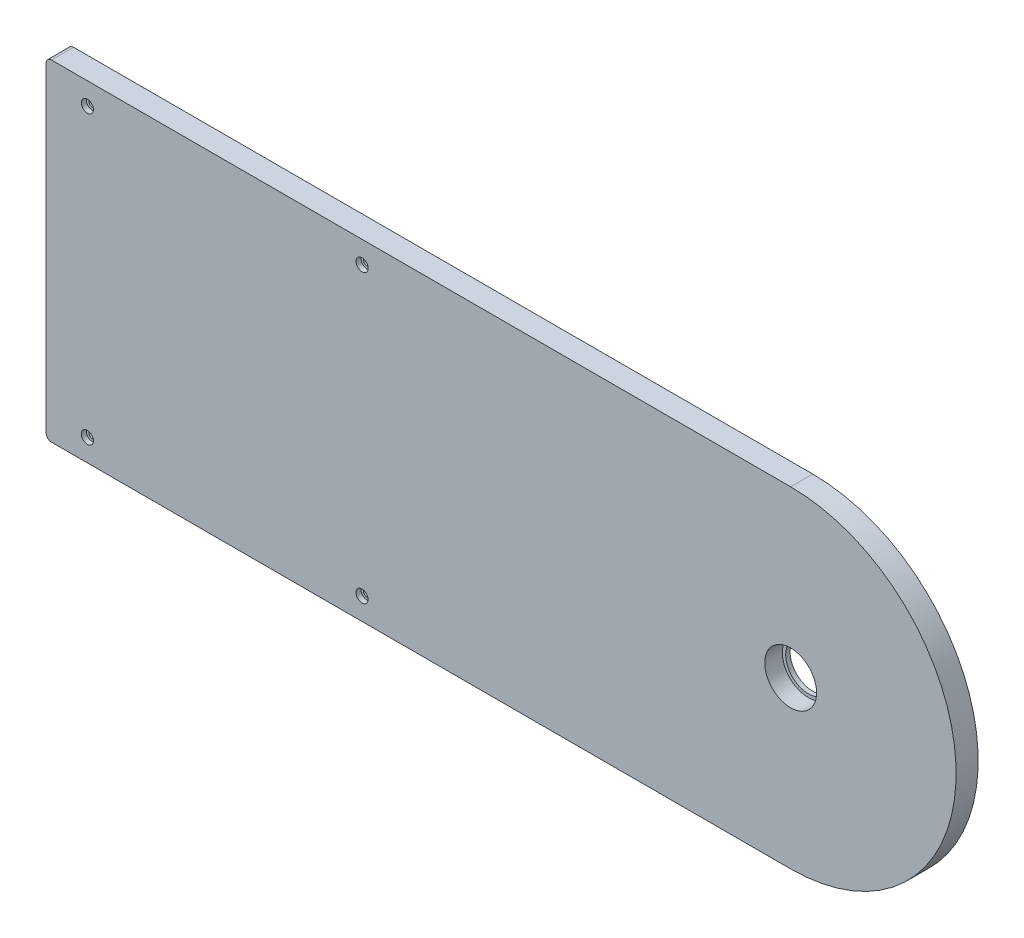
ISO-10303-21;
HEADER;
FILE_DESCRIPTION(('STEP AP214'),'2;1');
FILE_NAME('part.step','',(''),(''),'','','');
FILE_SCHEMA(('AUTOMOTIVE_DESIGN { 1 0 10303 214 1 1 1 1 }'));
ENDSEC;
DATA;
#1=APPLICATION_CONTEXT('core data for automotive mechanical design processes');
#2=APPLICATION_PROTOCOL_DEFINITION('international standard','automotive_design',2000,#1);
#3=PRODUCT_CONTEXT('',#1,'mechanical');
#4=PRODUCT('Part','Part','',(#3));
#5=PRODUCT_RELATED_PRODUCT_CATEGORY('part','',(#4));
#6=PRODUCT_DEFINITION_FORMATION('','',#4);
#7=PRODUCT_DEFINITION_CONTEXT('part definition',#1,'design');
#8=PRODUCT_DEFINITION('design','',#6,#7);
#9=PRODUCT_DEFINITION_SHAPE('','',#8);
#10=(LENGTH_UNIT() NAMED_UNIT(*) SI_UNIT(.MILLI.,.METRE.));
#11=(NAMED_UNIT(*) PLANE_ANGLE_UNIT() SI_UNIT($,.RADIAN.));
#12=(NAMED_UNIT(*) SI_UNIT($,.STERADIAN.) SOLID_ANGLE_UNIT());
#13=UNCERTAINTY_MEASURE_WITH_UNIT(LENGTH_MEASURE(1.E-05),#10,'distance_accuracy_value','');
#14=(GEOMETRIC_REPRESENTATION_CONTEXT(3) GLOBAL_UNCERTAINTY_ASSIGNED_CONTEXT((#13)) GLOBAL_UNIT_ASSIGNED_CONTEXT((#10,
#11,#12)) REPRESENTATION_CONTEXT('',''));
#15=CARTESIAN_POINT('',(0.,0.,0.));
#16=DIRECTION('',(0.,0.,1.));
#17=DIRECTION('',(1.,0.,0.));
#18=AXIS2_PLACEMENT_3D('',#15,#16,#17);
#19=CARTESIAN_POINT('',(-388.5,130.,-3.));
#20=DIRECTION('',(0.,0.,1.));
#21=DIRECTION('',(1.,0.,0.));
#22=AXIS2_PLACEMENT_3D('',#19,#20,#21);
#23=CYLINDRICAL_SURFACE('',#22,3.24999999999995);
#24=CARTESIAN_POINT('',(-388.5,130.,-3.));
#25=DIRECTION('',(0.,0.,1.));
#26=DIRECTION('',(1.,0.,0.));
#27=AXIS2_PLACEMENT_3D('',#24,#25,#26);
#28=CIRCLE('',#27,3.24999999999995);
#29=CARTESIAN_POINT('',(-385.25,130.,-3.));
#30=VERTEX_POINT('',#29);
#31=EDGE_CURVE('E637',#30,#30,#28,.T.);
#32=ORIENTED_EDGE('',*,*,#31,.F.);
#33=EDGE_LOOP('',(#32));
#34=FACE_BOUND('',#33,.T.);
#35=CARTESIAN_POINT('',(-388.5,130.,15.5));
#36=DIRECTION('',(0.,0.,1.));
#37=DIRECTION('',(1.,0.,0.));
#38=AXIS2_PLACEMENT_3D('',#35,#36,#37);
#39=CIRCLE('',#38,3.24999999999995);
#40=CARTESIAN_POINT('',(-385.25,130.,15.5));
#41=VERTEX_POINT('',#40);
#42=EDGE_CURVE('E284',#41,#41,#39,.F.);
#43=ORIENTED_EDGE('',*,*,#42,.F.);
#44=EDGE_LOOP('',(#43));
#45=FACE_BOUND('',#44,.T.);
#46=ADVANCED_FACE('F39',(#34,#45),#23,.F.);
#47=CARTESIAN_POINT('',(-637.5,130.,-3.));
#48=DIRECTION('',(0.,0.,1.));
#49=DIRECTION('',(1.,0.,0.));
#50=AXIS2_PLACEMENT_3D('',#47,#48,#49);
#51=CYLINDRICAL_SURFACE('',#50,3.24999999999995);
#52=CARTESIAN_POINT('',(-637.5,130.,-3.));
#53=DIRECTION('',(0.,0.,1.));
#54=DIRECTION('',(1.,0.,0.));
#55=AXIS2_PLACEMENT_3D('',#52,#53,#54);
#56=CIRCLE('',#55,3.24999999999995);
#57=CARTESIAN_POINT('',(-634.25,130.,-3.));
#58=VERTEX_POINT('',#57);
#59=EDGE_CURVE('E633',#58,#58,#56,.T.);
#60=ORIENTED_EDGE('',*,*,#59,.F.);
#61=EDGE_LOOP('',(#60));
#62=FACE_BOUND('',#61,.T.);
#63=CARTESIAN_POINT('',(-637.5,130.,15.5));
#64=DIRECTION('',(0.,0.,1.));
#65=DIRECTION('',(1.,0.,0.));
#66=AXIS2_PLACEMENT_3D('',#63,#64,#65);
#67=CIRCLE('',#66,3.24999999999995);
#68=CARTESIAN_POINT('',(-634.25,130.,15.5));
#69=VERTEX_POINT('',#68);
#70=EDGE_CURVE('E280',#69,#69,#67,.F.);
#71=ORIENTED_EDGE('',*,*,#70,.F.);
#72=EDGE_LOOP('',(#71));
#73=FACE_BOUND('',#72,.T.);
#74=ADVANCED_FACE('F331',(#62,#73),#51,.F.);
#75=CARTESIAN_POINT('',(-637.5,-130.,-3.));
#76=DIRECTION('',(0.,0.,1.));
#77=DIRECTION('',(1.,0.,0.));
#78=AXIS2_PLACEMENT_3D('',#75,#76,#77);
#79=CYLINDRICAL_SURFACE('',#78,3.24999999999995);
#80=CARTESIAN_POINT('',(-637.5,-130.,-3.));
#81=DIRECTION('',(0.,0.,1.));
#82=DIRECTION('',(1.,0.,0.));
#83=AXIS2_PLACEMENT_3D('',#80,#81,#82);
#84=CIRCLE('',#83,3.24999999999995);
#85=CARTESIAN_POINT('',(-634.25,-130.,-3.));
#86=VERTEX_POINT('',#85);
#87=EDGE_CURVE('E629',#86,#86,#84,.T.);
#88=ORIENTED_EDGE('',*,*,#87,.F.);
#89=EDGE_LOOP('',(#88));
#90=FACE_BOUND('',#89,.T.);
#91=CARTESIAN_POINT('',(-637.5,-130.,15.5));
#92=DIRECTION('',(0.,0.,1.));
#93=DIRECTION('',(1.,0.,0.));
#94=AXIS2_PLACEMENT_3D('',#91,#92,#93);
#95=CIRCLE('',#94,3.24999999999995);
#96=CARTESIAN_POINT('',(-634.25,-130.,15.5));
#97=VERTEX_POINT('',#96);
#98=EDGE_CURVE('E275',#97,#97,#95,.F.);
#99=ORIENTED_EDGE('',*,*,#98,.F.);
#100=EDGE_LOOP('',(#99));
#101=FACE_BOUND('',#100,.T.);
#102=ADVANCED_FACE('F337',(#90,#101),#79,.F.);
#103=CARTESIAN_POINT('',(-388.5,-130.,-3.));
#104=DIRECTION('',(0.,0.,1.));
#105=DIRECTION('',(1.,0.,0.));
#106=AXIS2_PLACEMENT_3D('',#103,#104,#105);
#107=CYLINDRICAL_SURFACE('',#106,3.24999999999995);
#108=CARTESIAN_POINT('',(-388.5,-130.,-3.));
#109=DIRECTION('',(0.,0.,1.));
#110=DIRECTION('',(1.,0.,0.));
#111=AXIS2_PLACEMENT_3D('',#108,#109,#110);
#112=CIRCLE('',#111,3.24999999999995);
#113=CARTESIAN_POINT('',(-385.25,-130.,-3.));
#114=VERTEX_POINT('',#113);
#115=EDGE_CURVE('E288',#114,#114,#112,.T.);
#116=ORIENTED_EDGE('',*,*,#115,.F.);
#117=EDGE_LOOP('',(#116));
#118=FACE_BOUND('',#117,.T.);
#119=CARTESIAN_POINT('',(-388.5,-130.,15.5));
#120=DIRECTION('',(0.,0.,1.));
#121=DIRECTION('',(1.,0.,0.));
#122=AXIS2_PLACEMENT_3D('',#119,#120,#121);
#123=CIRCLE('',#122,3.24999999999995);
#124=CARTESIAN_POINT('',(-385.25,-130.,15.5));
#125=VERTEX_POINT('',#124);
#126=EDGE_CURVE('E271',#125,#125,#123,.F.);
#127=ORIENTED_EDGE('',*,*,#126,.F.);
#128=EDGE_LOOP('',(#127));
#129=FACE_BOUND('',#128,.T.);
#130=ADVANCED_FACE('F344',(#118,#129),#107,.F.);
#131=CARTESIAN_POINT('',(0.,0.,0.));
#132=DIRECTION('',(0.,0.,1.));
#133=DIRECTION('',(1.,0.,0.));
#134=AXIS2_PLACEMENT_3D('',#131,#132,#133);
#135=PLANE('',#134);
#136=CARTESIAN_POINT('',(0.,0.,0.));
#137=DIRECTION('',(0.,0.,1.));
#138=DIRECTION('',(1.,0.,0.));
#139=AXIS2_PLACEMENT_3D('',#136,#137,#138);
#140=CIRCLE('',#139,20.5);
#141=CARTESIAN_POINT('',(20.5,0.,0.));
#142=VERTEX_POINT('',#141);
#143=EDGE_CURVE('E228',#142,#142,#140,.T.);
#144=ORIENTED_EDGE('',*,*,#143,.T.);
#145=EDGE_LOOP('',(#144));
#146=FACE_BOUND('',#145,.T.);
#147=DIRECTION('',(0.,-1.,0.));
#148=VECTOR('',#147,1.);
#149=CARTESIAN_POINT('',(-675.,150.,0.));
#150=LINE('',#149,#148);
#151=CARTESIAN_POINT('',(-675.,145.,0.));
#152=VERTEX_POINT('',#151);
#153=CARTESIAN_POINT('',(-675.,134.,0.));
#154=VERTEX_POINT('',#153);
#155=EDGE_CURVE('E170',#152,#154,#150,.T.);
#156=ORIENTED_EDGE('',*,*,#155,.F.);
#157=CARTESIAN_POINT('',(-670.,145.,0.));
#158=DIRECTION('',(0.,0.,1.));
#159=DIRECTION('',(1.,0.,0.));
#160=AXIS2_PLACEMENT_3D('',#157,#158,#159);
#161=CIRCLE('',#160,5.);
#162=CARTESIAN_POINT('',(-670.,150.,0.));
#163=VERTEX_POINT('',#162);
#164=EDGE_CURVE('E297',#152,#163,#161,.F.);
#165=ORIENTED_EDGE('',*,*,#164,.T.);
#166=DIRECTION('',(-1.,0.,0.));
#167=VECTOR('',#166,1.);
#168=CARTESIAN_POINT('',(0.,150.,0.));
#169=LINE('',#168,#167);
#170=CARTESIAN_POINT('',(0.,150.,0.));
#171=VERTEX_POINT('',#170);
#172=EDGE_CURVE('E251',#171,#163,#169,.T.);
#173=ORIENTED_EDGE('',*,*,#172,.F.);
#174=CARTESIAN_POINT('',(0.,0.,0.));
#175=DIRECTION('',(0.,0.,1.));
#176=DIRECTION('',(1.,0.,0.));
#177=AXIS2_PLACEMENT_3D('',#174,#175,#176);
#178=CIRCLE('',#177,150.);
#179=CARTESIAN_POINT('',(0.,-150.,0.));
#180=VERTEX_POINT('',#179);
#181=EDGE_CURVE('E232',#180,#171,#178,.T.);
#182=ORIENTED_EDGE('',*,*,#181,.F.);
#183=DIRECTION('',(1.,0.,0.));
#184=VECTOR('',#183,1.);
#185=CARTESIAN_POINT('',(-675.,-150.,0.));
#186=LINE('',#185,#184);
#187=CARTESIAN_POINT('',(-670.,-150.,0.));
#188=VERTEX_POINT('',#187);
#189=EDGE_CURVE('E238',#188,#180,#186,.T.);
#190=ORIENTED_EDGE('',*,*,#189,.F.);
#191=CARTESIAN_POINT('',(-670.,-145.,0.));
#192=DIRECTION('',(0.,0.,1.));
#193=DIRECTION('',(1.,0.,0.));
#194=AXIS2_PLACEMENT_3D('',#191,#192,#193);
#195=CIRCLE('',#194,5.);
#196=CARTESIAN_POINT('',(-675.,-145.,0.));
#197=VERTEX_POINT('',#196);
#198=EDGE_CURVE('E294',#188,#197,#195,.F.);
#199=ORIENTED_EDGE('',*,*,#198,.T.);
#200=CARTESIAN_POINT('',(-675.,-134.,0.));
#201=VERTEX_POINT('',#200);
#202=EDGE_CURVE('E254',#201,#197,#150,.T.);
#203=ORIENTED_EDGE('',*,*,#202,.F.);
#204=DIRECTION('',(-1.,0.,0.));
#205=VECTOR('',#204,1.);
#206=CARTESIAN_POINT('',(-675.,-134.,0.));
#207=LINE('',#206,#205);
#208=CARTESIAN_POINT('',(-356.25,-134.,0.));
#209=VERTEX_POINT('',#208);
#210=EDGE_CURVE('E188',#209,#201,#207,.T.);
#211=ORIENTED_EDGE('',*,*,#210,.F.);
#212=DIRECTION('',(0.,-1.,0.));
#213=VECTOR('',#212,1.);
#214=CARTESIAN_POINT('',(-356.25,-134.,0.));
#215=LINE('',#214,#213);
#216=CARTESIAN_POINT('',(-356.25,-126.,0.));
#217=VERTEX_POINT('',#216);
#218=EDGE_CURVE('E177',#217,#209,#215,.T.);
#219=ORIENTED_EDGE('',*,*,#218,.F.);
#220=DIRECTION('',(1.,0.,0.));
#221=VECTOR('',#220,1.);
#222=CARTESIAN_POINT('',(-675.,-126.,0.));
#223=LINE('',#222,#221);
#224=CARTESIAN_POINT('',(-675.,-126.,0.));
#225=VERTEX_POINT('',#224);
#226=EDGE_CURVE('E172',#225,#217,#223,.T.);
#227=ORIENTED_EDGE('',*,*,#226,.F.);
#228=CARTESIAN_POINT('',(-675.,126.,0.));
#229=VERTEX_POINT('',#228);
#230=EDGE_CURVE('E257',#229,#225,#150,.T.);
#231=ORIENTED_EDGE('',*,*,#230,.F.);
#232=DIRECTION('',(-1.,0.,0.));
#233=VECTOR('',#232,1.);
#234=CARTESIAN_POINT('',(-675.,126.,0.));
#235=LINE('',#234,#233);
#236=CARTESIAN_POINT('',(-356.25,126.,0.));
#237=VERTEX_POINT('',#236);
#238=EDGE_CURVE('E164',#237,#229,#235,.T.);
#239=ORIENTED_EDGE('',*,*,#238,.F.);
#240=DIRECTION('',(0.,-1.,0.));
#241=VECTOR('',#240,1.);
#242=CARTESIAN_POINT('',(-356.25,126.,0.));
#243=LINE('',#242,#241);
#244=CARTESIAN_POINT('',(-356.25,134.,0.));
#245=VERTEX_POINT('',#244);
#246=EDGE_CURVE('E649',#245,#237,#243,.T.);
#247=ORIENTED_EDGE('',*,*,#246,.F.);
#248=DIRECTION('',(1.,0.,0.));
#249=VECTOR('',#248,1.);
#250=CARTESIAN_POINT('',(-675.,134.,0.));
#251=LINE('',#250,#249);
#252=EDGE_CURVE('E640',#154,#245,#251,.T.);
#253=ORIENTED_EDGE('',*,*,#252,.F.);
#254=EDGE_LOOP('',(#156,#165,#173,#182,#190,#199,#203,#211,#219,#227,#231,#239,#247,#253));
#255=FACE_BOUND('',#254,.T.);
#256=ADVANCED_FACE('F312',(#146,#255),#135,.F.);
#257=CARTESIAN_POINT('',(0.,0.,20.));
#258=DIRECTION('',(0.,0.,-1.));
#259=DIRECTION('',(-1.,0.,0.));
#260=AXIS2_PLACEMENT_3D('',#257,#258,#259);
#261=CYLINDRICAL_SURFACE('',#260,20.5);
#262=ORIENTED_EDGE('',*,*,#143,.F.);
#263=EDGE_LOOP('',(#262));
#264=FACE_BOUND('',#263,.T.);
#265=CARTESIAN_POINT('',(0.,0.,4.));
#266=DIRECTION('',(0.,0.,1.));
#267=DIRECTION('',(1.,0.,0.));
#268=AXIS2_PLACEMENT_3D('',#265,#266,#267);
#269=CIRCLE('',#268,20.5);
#270=CARTESIAN_POINT('',(20.5,0.,4.));
#271=VERTEX_POINT('',#270);
#272=EDGE_CURVE('E224',#271,#271,#269,.T.);
#273=ORIENTED_EDGE('',*,*,#272,.T.);
#274=EDGE_LOOP('',(#273));
#275=FACE_BOUND('',#274,.T.);
#276=ADVANCED_FACE('F384',(#264,#275),#261,.F.);
#277=CARTESIAN_POINT('',(0.,0.,20.));
#278=DIRECTION('',(0.,0.,1.));
#279=DIRECTION('',(1.,0.,0.));
#280=AXIS2_PLACEMENT_3D('',#277,#278,#279);
#281=PLANE('',#280);
#282=CARTESIAN_POINT('',(-637.5,-130.,20.));
#283=DIRECTION('',(0.,0.,1.));
#284=DIRECTION('',(1.,0.,0.));
#285=AXIS2_PLACEMENT_3D('',#282,#283,#284);
#286=CIRCLE('',#285,5.50000000000007);
#287=CARTESIAN_POINT('',(-632.,-130.,20.));
#288=VERTEX_POINT('',#287);
#289=EDGE_CURVE('E685',#288,#288,#286,.T.);
#290=ORIENTED_EDGE('',*,*,#289,.F.);
#291=EDGE_LOOP('',(#290));
#292=FACE_BOUND('',#291,.T.);
#293=CARTESIAN_POINT('',(-388.5,-130.,20.));
#294=DIRECTION('',(0.,0.,1.));
#295=DIRECTION('',(1.,0.,0.));
#296=AXIS2_PLACEMENT_3D('',#293,#294,#295);
#297=CIRCLE('',#296,5.49999999999996);
#298=CARTESIAN_POINT('',(-383.,-130.,20.));
#299=VERTEX_POINT('',#298);
#300=EDGE_CURVE('E693',#299,#299,#297,.T.);
#301=ORIENTED_EDGE('',*,*,#300,.F.);
#302=EDGE_LOOP('',(#301));
#303=FACE_BOUND('',#302,.T.);
#304=CARTESIAN_POINT('',(-388.5,130.,20.));
#305=DIRECTION('',(0.,0.,1.));
#306=DIRECTION('',(1.,0.,0.));
#307=AXIS2_PLACEMENT_3D('',#304,#305,#306);
#308=CIRCLE('',#307,5.49999999999996);
#309=CARTESIAN_POINT('',(-383.,130.,20.));
#310=VERTEX_POINT('',#309);
#311=EDGE_CURVE('E701',#310,#310,#308,.T.);
#312=ORIENTED_EDGE('',*,*,#311,.F.);
#313=EDGE_LOOP('',(#312));
#314=FACE_BOUND('',#313,.T.);
#315=CARTESIAN_POINT('',(-637.5,130.,20.));
#316=DIRECTION('',(0.,0.,1.));
#317=DIRECTION('',(1.,0.,0.));
#318=AXIS2_PLACEMENT_3D('',#315,#316,#317);
#319=CIRCLE('',#318,5.50000000000007);
#320=CARTESIAN_POINT('',(-632.,130.,20.));
#321=VERTEX_POINT('',#320);
#322=EDGE_CURVE('E677',#321,#321,#319,.T.);
#323=ORIENTED_EDGE('',*,*,#322,.F.);
#324=EDGE_LOOP('',(#323));
#325=FACE_BOUND('',#324,.T.);
#326=CARTESIAN_POINT('',(0.,0.,20.));
#327=DIRECTION('',(0.,0.,1.));
#328=DIRECTION('',(1.,0.,0.));
#329=AXIS2_PLACEMENT_3D('',#326,#327,#328);
#330=CIRCLE('',#329,23.5);
#331=CARTESIAN_POINT('',(23.5,0.,20.));
#332=VERTEX_POINT('',#331);
#333=EDGE_CURVE('E219',#332,#332,#330,.T.);
#334=ORIENTED_EDGE('',*,*,#333,.F.);
#335=EDGE_LOOP('',(#334));
#336=FACE_BOUND('',#335,.T.);
#337=DIRECTION('',(-1.,0.,0.));
#338=VECTOR('',#337,1.);
#339=CARTESIAN_POINT('',(0.,150.,20.));
#340=LINE('',#339,#338);
#341=CARTESIAN_POINT('',(0.,150.,20.));
#342=VERTEX_POINT('',#341);
#343=CARTESIAN_POINT('',(-670.,150.,20.));
#344=VERTEX_POINT('',#343);
#345=EDGE_CURVE('E237',#342,#344,#340,.T.);
#346=ORIENTED_EDGE('',*,*,#345,.T.);
#347=CARTESIAN_POINT('',(-670.,145.,20.));
#348=DIRECTION('',(0.,0.,1.));
#349=DIRECTION('',(1.,0.,0.));
#350=AXIS2_PLACEMENT_3D('',#347,#348,#349);
#351=CIRCLE('',#350,5.);
#352=CARTESIAN_POINT('',(-675.,145.,20.));
#353=VERTEX_POINT('',#352);
#354=EDGE_CURVE('E48',#344,#353,#351,.T.);
#355=ORIENTED_EDGE('',*,*,#354,.T.);
#356=DIRECTION('',(0.,-1.,0.));
#357=VECTOR('',#356,1.);
#358=CARTESIAN_POINT('',(-675.,150.,20.));
#359=LINE('',#358,#357);
#360=CARTESIAN_POINT('',(-675.,-145.,20.));
#361=VERTEX_POINT('',#360);
#362=EDGE_CURVE('E241',#353,#361,#359,.T.);
#363=ORIENTED_EDGE('',*,*,#362,.T.);
#364=CARTESIAN_POINT('',(-670.,-145.,20.));
#365=DIRECTION('',(0.,0.,1.));
#366=DIRECTION('',(1.,0.,0.));
#367=AXIS2_PLACEMENT_3D('',#364,#365,#366);
#368=CIRCLE('',#367,5.);
#369=CARTESIAN_POINT('',(-670.,-150.,20.));
#370=VERTEX_POINT('',#369);
#371=EDGE_CURVE('E55',#361,#370,#368,.T.);
#372=ORIENTED_EDGE('',*,*,#371,.T.);
#373=DIRECTION('',(1.,0.,0.));
#374=VECTOR('',#373,1.);
#375=CARTESIAN_POINT('',(-675.,-150.,20.));
#376=LINE('',#375,#374);
#377=CARTESIAN_POINT('',(0.,-150.,20.));
#378=VERTEX_POINT('',#377);
#379=EDGE_CURVE('E244',#370,#378,#376,.T.);
#380=ORIENTED_EDGE('',*,*,#379,.T.);
#381=CARTESIAN_POINT('',(0.,0.,20.));
#382=DIRECTION('',(0.,0.,1.));
#383=DIRECTION('',(1.,0.,0.));
#384=AXIS2_PLACEMENT_3D('',#381,#382,#383);
#385=CIRCLE('',#384,150.);
#386=EDGE_CURVE('E233',#378,#342,#385,.T.);
#387=ORIENTED_EDGE('',*,*,#386,.T.);
#388=EDGE_LOOP('',(#346,#355,#363,#372,#380,#387));
#389=FACE_BOUND('',#388,.T.);
#390=ADVANCED_FACE('F305',(#292,#303,#314,#325,#336,#389),#281,.T.);
#391=CARTESIAN_POINT('',(0.,0.,20.));
#392=DIRECTION('',(0.,0.,-1.));
#393=DIRECTION('',(-1.,0.,0.));
#394=AXIS2_PLACEMENT_3D('',#391,#392,#393);
#395=CYLINDRICAL_SURFACE('',#394,150.);
#396=ORIENTED_EDGE('',*,*,#181,.T.);
#397=DIRECTION('',(0.,0.,-1.));
#398=VECTOR('',#397,1.);
#399=CARTESIAN_POINT('',(0.,150.,20.));
#400=LINE('',#399,#398);
#401=EDGE_CURVE('E263',#342,#171,#400,.T.);
#402=ORIENTED_EDGE('',*,*,#401,.F.);
#403=ORIENTED_EDGE('',*,*,#386,.F.);
#404=DIRECTION('',(0.,0.,-1.));
#405=VECTOR('',#404,1.);
#406=CARTESIAN_POINT('',(0.,-150.,20.));
#407=LINE('',#406,#405);
#408=EDGE_CURVE('E247',#378,#180,#407,.T.);
#409=ORIENTED_EDGE('',*,*,#408,.T.);
#410=EDGE_LOOP('',(#396,#402,#403,#409));
#411=FACE_BOUND('',#410,.T.);
#412=ADVANCED_FACE('F318',(#411),#395,.T.);
#413=CARTESIAN_POINT('',(0.,150.,20.));
#414=DIRECTION('',(0.,-1.,0.));
#415=DIRECTION('',(0.,0.,-1.));
#416=AXIS2_PLACEMENT_3D('',#413,#414,#415);
#417=PLANE('',#416);
#418=ORIENTED_EDGE('',*,*,#172,.T.);
#419=DIRECTION('',(0.,0.,-1.));
#420=VECTOR('',#419,1.);
#421=CARTESIAN_POINT('',(-670.,150.,20.));
#422=LINE('',#421,#420);
#423=EDGE_CURVE('E63',#163,#344,#422,.F.);
#424=ORIENTED_EDGE('',*,*,#423,.T.);
#425=ORIENTED_EDGE('',*,*,#345,.F.);
#426=ORIENTED_EDGE('',*,*,#401,.T.);
#427=EDGE_LOOP('',(#418,#424,#425,#426));
#428=FACE_BOUND('',#427,.T.);
#429=ADVANCED_FACE('F314',(#428),#417,.F.);
#430=CARTESIAN_POINT('',(-675.,150.,20.));
#431=DIRECTION('',(1.,0.,0.));
#432=DIRECTION('',(0.,0.,-1.));
#433=AXIS2_PLACEMENT_3D('',#430,#431,#432);
#434=PLANE('',#433);
#435=ORIENTED_EDGE('',*,*,#362,.F.);
#436=DIRECTION('',(0.,0.,-1.));
#437=VECTOR('',#436,1.);
#438=CARTESIAN_POINT('',(-675.,145.,20.));
#439=LINE('',#438,#437);
#440=EDGE_CURVE('E291',#353,#152,#439,.T.);
#441=ORIENTED_EDGE('',*,*,#440,.T.);
#442=ORIENTED_EDGE('',*,*,#155,.T.);
#443=DIRECTION('',(0.,0.,1.));
#444=VECTOR('',#443,1.);
#445=CARTESIAN_POINT('',(-675.,134.,-3.));
#446=LINE('',#445,#444);
#447=CARTESIAN_POINT('',(-675.,134.,-3.));
#448=VERTEX_POINT('',#447);
#449=EDGE_CURVE('E147',#448,#154,#446,.T.);
#450=ORIENTED_EDGE('',*,*,#449,.F.);
#451=DIRECTION('',(0.,1.,0.));
#452=VECTOR('',#451,1.);
#453=CARTESIAN_POINT('',(-675.,126.,-3.));
#454=LINE('',#453,#452);
#455=CARTESIAN_POINT('',(-675.,126.,-3.));
#456=VERTEX_POINT('',#455);
#457=EDGE_CURVE('E155',#456,#448,#454,.T.);
#458=ORIENTED_EDGE('',*,*,#457,.F.);
#459=DIRECTION('',(0.,0.,1.));
#460=VECTOR('',#459,1.);
#461=CARTESIAN_POINT('',(-675.,126.,-3.));
#462=LINE('',#461,#460);
#463=EDGE_CURVE('E646',#456,#229,#462,.T.);
#464=ORIENTED_EDGE('',*,*,#463,.T.);
#465=ORIENTED_EDGE('',*,*,#230,.T.);
#466=DIRECTION('',(0.,0.,1.));
#467=VECTOR('',#466,1.);
#468=CARTESIAN_POINT('',(-675.,-126.,-3.));
#469=LINE('',#468,#467);
#470=CARTESIAN_POINT('',(-675.,-126.,-3.));
#471=VERTEX_POINT('',#470);
#472=EDGE_CURVE('E215',#471,#225,#469,.T.);
#473=ORIENTED_EDGE('',*,*,#472,.F.);
#474=DIRECTION('',(0.,1.,0.));
#475=VECTOR('',#474,1.);
#476=CARTESIAN_POINT('',(-675.,-134.,-3.));
#477=LINE('',#476,#475);
#478=CARTESIAN_POINT('',(-675.,-134.,-3.));
#479=VERTEX_POINT('',#478);
#480=EDGE_CURVE('E183',#479,#471,#477,.T.);
#481=ORIENTED_EDGE('',*,*,#480,.F.);
#482=DIRECTION('',(0.,0.,1.));
#483=VECTOR('',#482,1.);
#484=CARTESIAN_POINT('',(-675.,-134.,-3.));
#485=LINE('',#484,#483);
#486=EDGE_CURVE('E196',#479,#201,#485,.T.);
#487=ORIENTED_EDGE('',*,*,#486,.T.);
#488=ORIENTED_EDGE('',*,*,#202,.T.);
#489=DIRECTION('',(0.,0.,-1.));
#490=VECTOR('',#489,1.);
#491=CARTESIAN_POINT('',(-675.,-145.,20.));
#492=LINE('',#491,#490);
#493=EDGE_CURVE('E267',#197,#361,#492,.F.);
#494=ORIENTED_EDGE('',*,*,#493,.T.);
#495=EDGE_LOOP('',(#435,#441,#442,#450,#458,#464,#465,#473,#481,#487,#488,#494));
#496=FACE_BOUND('',#495,.T.);
#497=ADVANCED_FACE('F167',(#496),#434,.F.);
#498=CARTESIAN_POINT('',(-675.,-150.,20.));
#499=DIRECTION('',(0.,1.,0.));
#500=DIRECTION('',(0.,0.,1.));
#501=AXIS2_PLACEMENT_3D('',#498,#499,#500);
#502=PLANE('',#501);
#503=ORIENTED_EDGE('',*,*,#379,.F.);
#504=DIRECTION('',(0.,0.,-1.));
#505=VECTOR('',#504,1.);
#506=CARTESIAN_POINT('',(-670.,-150.,20.));
#507=LINE('',#506,#505);
#508=EDGE_CURVE('E11',#370,#188,#507,.T.);
#509=ORIENTED_EDGE('',*,*,#508,.T.);
#510=ORIENTED_EDGE('',*,*,#189,.T.);
#511=ORIENTED_EDGE('',*,*,#408,.F.);
#512=EDGE_LOOP('',(#503,#509,#510,#511));
#513=FACE_BOUND('',#512,.T.);
#514=ADVANCED_FACE('F322',(#513),#502,.F.);
#515=CARTESIAN_POINT('',(0.,0.,4.));
#516=DIRECTION('',(0.,0.,1.));
#517=DIRECTION('',(1.,0.,0.));
#518=AXIS2_PLACEMENT_3D('',#515,#516,#517);
#519=CYLINDRICAL_SURFACE('',#518,23.5);
#520=CARTESIAN_POINT('',(0.,0.,4.));
#521=DIRECTION('',(0.,0.,1.));
#522=DIRECTION('',(1.,0.,0.));
#523=AXIS2_PLACEMENT_3D('',#520,#521,#522);
#524=CIRCLE('',#523,23.5);
#525=CARTESIAN_POINT('',(23.5,0.,4.));
#526=VERTEX_POINT('',#525);
#527=EDGE_CURVE('E220',#526,#526,#524,.T.);
#528=ORIENTED_EDGE('',*,*,#527,.F.);
#529=EDGE_LOOP('',(#528));
#530=FACE_BOUND('',#529,.T.);
#531=ORIENTED_EDGE('',*,*,#333,.T.);
#532=EDGE_LOOP('',(#531));
#533=FACE_BOUND('',#532,.T.);
#534=ADVANCED_FACE('F379',(#530,#533),#519,.F.);
#535=CARTESIAN_POINT('',(0.,0.,4.));
#536=DIRECTION('',(0.,0.,1.));
#537=DIRECTION('',(1.,0.,0.));
#538=AXIS2_PLACEMENT_3D('',#535,#536,#537);
#539=PLANE('',#538);
#540=ORIENTED_EDGE('',*,*,#272,.F.);
#541=EDGE_LOOP('',(#540));
#542=FACE_BOUND('',#541,.T.);
#543=ORIENTED_EDGE('',*,*,#527,.T.);
#544=EDGE_LOOP('',(#543));
#545=FACE_BOUND('',#544,.T.);
#546=ADVANCED_FACE('F375',(#542,#545),#539,.T.);
#547=CARTESIAN_POINT('',(-675.,-126.,-3.));
#548=DIRECTION('',(0.,-1.,0.));
#549=DIRECTION('',(0.,0.,-1.));
#550=AXIS2_PLACEMENT_3D('',#547,#548,#549);
#551=PLANE('',#550);
#552=ORIENTED_EDGE('',*,*,#226,.T.);
#553=DIRECTION('',(0.,0.,1.));
#554=VECTOR('',#553,1.);
#555=CARTESIAN_POINT('',(-356.25,-126.,-3.));
#556=LINE('',#555,#554);
#557=CARTESIAN_POINT('',(-356.25,-126.,-3.));
#558=VERTEX_POINT('',#557);
#559=EDGE_CURVE('E211',#558,#217,#556,.T.);
#560=ORIENTED_EDGE('',*,*,#559,.F.);
#561=DIRECTION('',(1.,0.,0.));
#562=VECTOR('',#561,1.);
#563=CARTESIAN_POINT('',(-675.,-126.,-3.));
#564=LINE('',#563,#562);
#565=EDGE_CURVE('E187',#471,#558,#564,.T.);
#566=ORIENTED_EDGE('',*,*,#565,.F.);
#567=ORIENTED_EDGE('',*,*,#472,.T.);
#568=EDGE_LOOP('',(#552,#560,#566,#567));
#569=FACE_BOUND('',#568,.T.);
#570=ADVANCED_FACE('F371',(#569),#551,.F.);
#571=CARTESIAN_POINT('',(-356.25,-134.,-3.));
#572=DIRECTION('',(-1.,0.,0.));
#573=DIRECTION('',(0.,0.,1.));
#574=AXIS2_PLACEMENT_3D('',#571,#572,#573);
#575=PLANE('',#574);
#576=ORIENTED_EDGE('',*,*,#218,.T.);
#577=DIRECTION('',(0.,0.,1.));
#578=VECTOR('',#577,1.);
#579=CARTESIAN_POINT('',(-356.25,-134.,-3.));
#580=LINE('',#579,#578);
#581=CARTESIAN_POINT('',(-356.25,-134.,-3.));
#582=VERTEX_POINT('',#581);
#583=EDGE_CURVE('E207',#582,#209,#580,.T.);
#584=ORIENTED_EDGE('',*,*,#583,.F.);
#585=DIRECTION('',(0.,-1.,0.));
#586=VECTOR('',#585,1.);
#587=CARTESIAN_POINT('',(-356.25,-134.,-3.));
#588=LINE('',#587,#586);
#589=EDGE_CURVE('E191',#558,#582,#588,.T.);
#590=ORIENTED_EDGE('',*,*,#589,.F.);
#591=ORIENTED_EDGE('',*,*,#559,.T.);
#592=EDGE_LOOP('',(#576,#584,#590,#591));
#593=FACE_BOUND('',#592,.T.);
#594=ADVANCED_FACE('F367',(#593),#575,.F.);
#595=CARTESIAN_POINT('',(-675.,-134.,-3.));
#596=DIRECTION('',(0.,1.,0.));
#597=DIRECTION('',(-1.,0.,0.));
#598=AXIS2_PLACEMENT_3D('',#595,#596,#597);
#599=PLANE('',#598);
#600=ORIENTED_EDGE('',*,*,#210,.T.);
#601=ORIENTED_EDGE('',*,*,#486,.F.);
#602=DIRECTION('',(-1.,0.,0.));
#603=VECTOR('',#602,1.);
#604=CARTESIAN_POINT('',(-675.,-134.,-3.));
#605=LINE('',#604,#603);
#606=EDGE_CURVE('E194',#582,#479,#605,.T.);
#607=ORIENTED_EDGE('',*,*,#606,.F.);
#608=ORIENTED_EDGE('',*,*,#583,.T.);
#609=EDGE_LOOP('',(#600,#601,#607,#608));
#610=FACE_BOUND('',#609,.T.);
#611=ADVANCED_FACE('F363',(#610),#599,.F.);
#612=CARTESIAN_POINT('',(0.,0.,-3.));
#613=DIRECTION('',(0.,0.,-1.));
#614=DIRECTION('',(-1.,0.,0.));
#615=AXIS2_PLACEMENT_3D('',#612,#613,#614);
#616=PLANE('',#615);
#617=ORIENTED_EDGE('',*,*,#115,.T.);
#618=EDGE_LOOP('',(#617));
#619=FACE_BOUND('',#618,.T.);
#620=ORIENTED_EDGE('',*,*,#87,.T.);
#621=EDGE_LOOP('',(#620));
#622=FACE_BOUND('',#621,.T.);
#623=ORIENTED_EDGE('',*,*,#480,.T.);
#624=ORIENTED_EDGE('',*,*,#565,.T.);
#625=ORIENTED_EDGE('',*,*,#589,.T.);
#626=ORIENTED_EDGE('',*,*,#606,.T.);
#627=EDGE_LOOP('',(#623,#624,#625,#626));
#628=FACE_BOUND('',#627,.T.);
#629=ADVANCED_FACE('F360',(#619,#622,#628),#616,.T.);
#630=CARTESIAN_POINT('',(-675.,134.,-3.));
#631=DIRECTION('',(0.,-1.,0.));
#632=DIRECTION('',(1.,0.,0.));
#633=AXIS2_PLACEMENT_3D('',#630,#631,#632);
#634=PLANE('',#633);
#635=ORIENTED_EDGE('',*,*,#252,.T.);
#636=DIRECTION('',(0.,0.,1.));
#637=VECTOR('',#636,1.);
#638=CARTESIAN_POINT('',(-356.25,134.,-3.));
#639=LINE('',#638,#637);
#640=CARTESIAN_POINT('',(-356.25,134.,-3.));
#641=VERTEX_POINT('',#640);
#642=EDGE_CURVE('E150',#641,#245,#639,.T.);
#643=ORIENTED_EDGE('',*,*,#642,.F.);
#644=DIRECTION('',(1.,0.,0.));
#645=VECTOR('',#644,1.);
#646=CARTESIAN_POINT('',(-675.,134.,-3.));
#647=LINE('',#646,#645);
#648=EDGE_CURVE('E143',#448,#641,#647,.T.);
#649=ORIENTED_EDGE('',*,*,#648,.F.);
#650=ORIENTED_EDGE('',*,*,#449,.T.);
#651=EDGE_LOOP('',(#635,#643,#649,#650));
#652=FACE_BOUND('',#651,.T.);
#653=ADVANCED_FACE('F145',(#652),#634,.F.);
#654=CARTESIAN_POINT('',(-356.25,126.,-3.));
#655=DIRECTION('',(-1.,0.,0.));
#656=DIRECTION('',(0.,0.,1.));
#657=AXIS2_PLACEMENT_3D('',#654,#655,#656);
#658=PLANE('',#657);
#659=ORIENTED_EDGE('',*,*,#246,.T.);
#660=DIRECTION('',(0.,0.,1.));
#661=VECTOR('',#660,1.);
#662=CARTESIAN_POINT('',(-356.25,126.,-3.));
#663=LINE('',#662,#661);
#664=CARTESIAN_POINT('',(-356.25,126.,-3.));
#665=VERTEX_POINT('',#664);
#666=EDGE_CURVE('E179',#665,#237,#663,.T.);
#667=ORIENTED_EDGE('',*,*,#666,.F.);
#668=DIRECTION('',(0.,-1.,0.));
#669=VECTOR('',#668,1.);
#670=CARTESIAN_POINT('',(-356.25,126.,-3.));
#671=LINE('',#670,#669);
#672=EDGE_CURVE('E154',#641,#665,#671,.T.);
#673=ORIENTED_EDGE('',*,*,#672,.F.);
#674=ORIENTED_EDGE('',*,*,#642,.T.);
#675=EDGE_LOOP('',(#659,#667,#673,#674));
#676=FACE_BOUND('',#675,.T.);
#677=ADVANCED_FACE('F353',(#676),#658,.F.);
#678=CARTESIAN_POINT('',(-675.,126.,-3.));
#679=DIRECTION('',(0.,1.,0.));
#680=DIRECTION('',(-1.,0.,0.));
#681=AXIS2_PLACEMENT_3D('',#678,#679,#680);
#682=PLANE('',#681);
#683=ORIENTED_EDGE('',*,*,#238,.T.);
#684=ORIENTED_EDGE('',*,*,#463,.F.);
#685=DIRECTION('',(-1.,0.,0.));
#686=VECTOR('',#685,1.);
#687=CARTESIAN_POINT('',(-675.,126.,-3.));
#688=LINE('',#687,#686);
#689=EDGE_CURVE('E160',#665,#456,#688,.T.);
#690=ORIENTED_EDGE('',*,*,#689,.F.);
#691=ORIENTED_EDGE('',*,*,#666,.T.);
#692=EDGE_LOOP('',(#683,#684,#690,#691));
#693=FACE_BOUND('',#692,.T.);
#694=ADVANCED_FACE('F349',(#693),#682,.F.);
#695=CARTESIAN_POINT('',(0.,0.,-3.));
#696=DIRECTION('',(0.,0.,-1.));
#697=DIRECTION('',(-1.,0.,0.));
#698=AXIS2_PLACEMENT_3D('',#695,#696,#697);
#699=PLANE('',#698);
#700=ORIENTED_EDGE('',*,*,#59,.T.);
#701=EDGE_LOOP('',(#700));
#702=FACE_BOUND('',#701,.T.);
#703=ORIENTED_EDGE('',*,*,#31,.T.);
#704=EDGE_LOOP('',(#703));
#705=FACE_BOUND('',#704,.T.);
#706=ORIENTED_EDGE('',*,*,#457,.T.);
#707=ORIENTED_EDGE('',*,*,#648,.T.);
#708=ORIENTED_EDGE('',*,*,#672,.T.);
#709=ORIENTED_EDGE('',*,*,#689,.T.);
#710=EDGE_LOOP('',(#706,#707,#708,#709));
#711=FACE_BOUND('',#710,.T.);
#712=ADVANCED_FACE('F158',(#702,#705,#711),#699,.T.);
#713=CARTESIAN_POINT('',(-388.5,-130.,15.5));
#714=DIRECTION('',(0.,0.,1.));
#715=DIRECTION('',(1.,0.,0.));
#716=AXIS2_PLACEMENT_3D('',#713,#714,#715);
#717=PLANE('',#716);
#718=CARTESIAN_POINT('',(-388.5,-130.,15.5));
#719=DIRECTION('',(0.,0.,1.));
#720=DIRECTION('',(1.,0.,0.));
#721=AXIS2_PLACEMENT_3D('',#718,#719,#720);
#722=CIRCLE('',#721,5.49999999999996);
#723=CARTESIAN_POINT('',(-383.,-130.,15.5));
#724=VERTEX_POINT('',#723);
#725=EDGE_CURVE('E697',#724,#724,#722,.T.);
#726=ORIENTED_EDGE('',*,*,#725,.T.);
#727=EDGE_LOOP('',(#726));
#728=FACE_BOUND('',#727,.T.);
#729=ORIENTED_EDGE('',*,*,#126,.T.);
#730=EDGE_LOOP('',(#729));
#731=FACE_BOUND('',#730,.T.);
#732=ADVANCED_FACE('F348',(#728,#731),#717,.T.);
#733=CARTESIAN_POINT('',(-388.5,-130.,15.5));
#734=DIRECTION('',(0.,0.,1.));
#735=DIRECTION('',(1.,0.,0.));
#736=AXIS2_PLACEMENT_3D('',#733,#734,#735);
#737=CYLINDRICAL_SURFACE('',#736,5.49999999999996);
#738=ORIENTED_EDGE('',*,*,#725,.F.);
#739=EDGE_LOOP('',(#738));
#740=FACE_BOUND('',#739,.T.);
#741=ORIENTED_EDGE('',*,*,#300,.T.);
#742=EDGE_LOOP('',(#741));
#743=FACE_BOUND('',#742,.T.);
#744=ADVANCED_FACE('F465',(#740,#743),#737,.F.);
#745=CARTESIAN_POINT('',(-637.5,-130.,15.5));
#746=DIRECTION('',(0.,0.,1.));
#747=DIRECTION('',(1.,0.,0.));
#748=AXIS2_PLACEMENT_3D('',#745,#746,#747);
#749=PLANE('',#748);
#750=CARTESIAN_POINT('',(-637.5,-130.,15.5));
#751=DIRECTION('',(0.,0.,1.));
#752=DIRECTION('',(1.,0.,0.));
#753=AXIS2_PLACEMENT_3D('',#750,#751,#752);
#754=CIRCLE('',#753,5.50000000000007);
#755=CARTESIAN_POINT('',(-632.,-130.,15.5));
#756=VERTEX_POINT('',#755);
#757=EDGE_CURVE('E689',#756,#756,#754,.T.);
#758=ORIENTED_EDGE('',*,*,#757,.T.);
#759=EDGE_LOOP('',(#758));
#760=FACE_BOUND('',#759,.T.);
#761=ORIENTED_EDGE('',*,*,#98,.T.);
#762=EDGE_LOOP('',(#761));
#763=FACE_BOUND('',#762,.T.);
#764=ADVANCED_FACE('F474',(#760,#763),#749,.T.);
#765=CARTESIAN_POINT('',(-637.5,-130.,15.5));
#766=DIRECTION('',(0.,0.,1.));
#767=DIRECTION('',(1.,0.,0.));
#768=AXIS2_PLACEMENT_3D('',#765,#766,#767);
#769=CYLINDRICAL_SURFACE('',#768,5.50000000000007);
#770=ORIENTED_EDGE('',*,*,#757,.F.);
#771=EDGE_LOOP('',(#770));
#772=FACE_BOUND('',#771,.T.);
#773=ORIENTED_EDGE('',*,*,#289,.T.);
#774=EDGE_LOOP('',(#773));
#775=FACE_BOUND('',#774,.T.);
#776=ADVANCED_FACE('F482',(#772,#775),#769,.F.);
#777=CARTESIAN_POINT('',(-637.5,130.,15.5));
#778=DIRECTION('',(0.,0.,1.));
#779=DIRECTION('',(1.,0.,0.));
#780=AXIS2_PLACEMENT_3D('',#777,#778,#779);
#781=PLANE('',#780);
#782=CARTESIAN_POINT('',(-637.5,130.,15.5));
#783=DIRECTION('',(0.,0.,1.));
#784=DIRECTION('',(1.,0.,0.));
#785=AXIS2_PLACEMENT_3D('',#782,#783,#784);
#786=CIRCLE('',#785,5.50000000000007);
#787=CARTESIAN_POINT('',(-632.,130.,15.5));
#788=VERTEX_POINT('',#787);
#789=EDGE_CURVE('E276',#788,#788,#786,.T.);
#790=ORIENTED_EDGE('',*,*,#789,.T.);
#791=EDGE_LOOP('',(#790));
#792=FACE_BOUND('',#791,.T.);
#793=ORIENTED_EDGE('',*,*,#70,.T.);
#794=EDGE_LOOP('',(#793));
#795=FACE_BOUND('',#794,.T.);
#796=ADVANCED_FACE('F490',(#792,#795),#781,.T.);
#797=CARTESIAN_POINT('',(-637.5,130.,15.5));
#798=DIRECTION('',(0.,0.,1.));
#799=DIRECTION('',(1.,0.,0.));
#800=AXIS2_PLACEMENT_3D('',#797,#798,#799);
#801=CYLINDRICAL_SURFACE('',#800,5.50000000000007);
#802=ORIENTED_EDGE('',*,*,#789,.F.);
#803=EDGE_LOOP('',(#802));
#804=FACE_BOUND('',#803,.T.);
#805=ORIENTED_EDGE('',*,*,#322,.T.);
#806=EDGE_LOOP('',(#805));
#807=FACE_BOUND('',#806,.T.);
#808=ADVANCED_FACE('F498',(#804,#807),#801,.F.);
#809=CARTESIAN_POINT('',(-388.5,130.,15.5));
#810=DIRECTION('',(0.,0.,1.));
#811=DIRECTION('',(1.,0.,0.));
#812=AXIS2_PLACEMENT_3D('',#809,#810,#811);
#813=PLANE('',#812);
#814=CARTESIAN_POINT('',(-388.5,130.,15.5));
#815=DIRECTION('',(0.,0.,1.));
#816=DIRECTION('',(1.,0.,0.));
#817=AXIS2_PLACEMENT_3D('',#814,#815,#816);
#818=CIRCLE('',#817,5.49999999999996);
#819=CARTESIAN_POINT('',(-383.,130.,15.5));
#820=VERTEX_POINT('',#819);
#821=EDGE_CURVE('E681',#820,#820,#818,.T.);
#822=ORIENTED_EDGE('',*,*,#821,.T.);
#823=EDGE_LOOP('',(#822));
#824=FACE_BOUND('',#823,.T.);
#825=ORIENTED_EDGE('',*,*,#42,.T.);
#826=EDGE_LOOP('',(#825));
#827=FACE_BOUND('',#826,.T.);
#828=ADVANCED_FACE('F506',(#824,#827),#813,.T.);
#829=CARTESIAN_POINT('',(-388.5,130.,15.5));
#830=DIRECTION('',(0.,0.,1.));
#831=DIRECTION('',(1.,0.,0.));
#832=AXIS2_PLACEMENT_3D('',#829,#830,#831);
#833=CYLINDRICAL_SURFACE('',#832,5.49999999999996);
#834=ORIENTED_EDGE('',*,*,#821,.F.);
#835=EDGE_LOOP('',(#834));
#836=FACE_BOUND('',#835,.T.);
#837=ORIENTED_EDGE('',*,*,#311,.T.);
#838=EDGE_LOOP('',(#837));
#839=FACE_BOUND('',#838,.T.);
#840=ADVANCED_FACE('F329',(#836,#839),#833,.F.);
#841=CARTESIAN_POINT('',(-670.,145.,20.));
#842=DIRECTION('',(0.,0.,-1.));
#843=DIRECTION('',(-1.,0.,0.));
#844=AXIS2_PLACEMENT_3D('',#841,#842,#843);
#845=CYLINDRICAL_SURFACE('',#844,5.);
#846=ORIENTED_EDGE('',*,*,#354,.F.);
#847=ORIENTED_EDGE('',*,*,#423,.F.);
#848=ORIENTED_EDGE('',*,*,#164,.F.);
#849=ORIENTED_EDGE('',*,*,#440,.F.);
#850=EDGE_LOOP('',(#846,#847,#848,#849));
#851=FACE_BOUND('',#850,.T.);
#852=ADVANCED_FACE('F310',(#851),#845,.T.);
#853=CARTESIAN_POINT('',(-670.,-145.,20.));
#854=DIRECTION('',(0.,0.,-1.));
#855=DIRECTION('',(-1.,0.,0.));
#856=AXIS2_PLACEMENT_3D('',#853,#854,#855);
#857=CYLINDRICAL_SURFACE('',#856,5.);
#858=ORIENTED_EDGE('',*,*,#371,.F.);
#859=ORIENTED_EDGE('',*,*,#493,.F.);
#860=ORIENTED_EDGE('',*,*,#198,.F.);
#861=ORIENTED_EDGE('',*,*,#508,.F.);
#862=EDGE_LOOP('',(#858,#859,#860,#861));
#863=FACE_BOUND('',#862,.T.);
#864=ADVANCED_FACE('F41',(#863),#857,.T.);
#865=CLOSED_SHELL('',(#46,#74,#102,#130,#256,#276,#390,#412,#429,#497,#514,#534,#546,#570,#594,
#611,#629,#653,#677,#694,#712,#732,#744,#764,#776,#796,#808,#828,#840,#852,#864));
#866=MANIFOLD_SOLID_BREP('B2',#865);
#867=ADVANCED_BREP_SHAPE_REPRESENTATION('',(#18,#866),#14);
#868=SHAPE_DEFINITION_REPRESENTATION(#9,#867);
ENDSEC;
END-ISO-10303-21;
